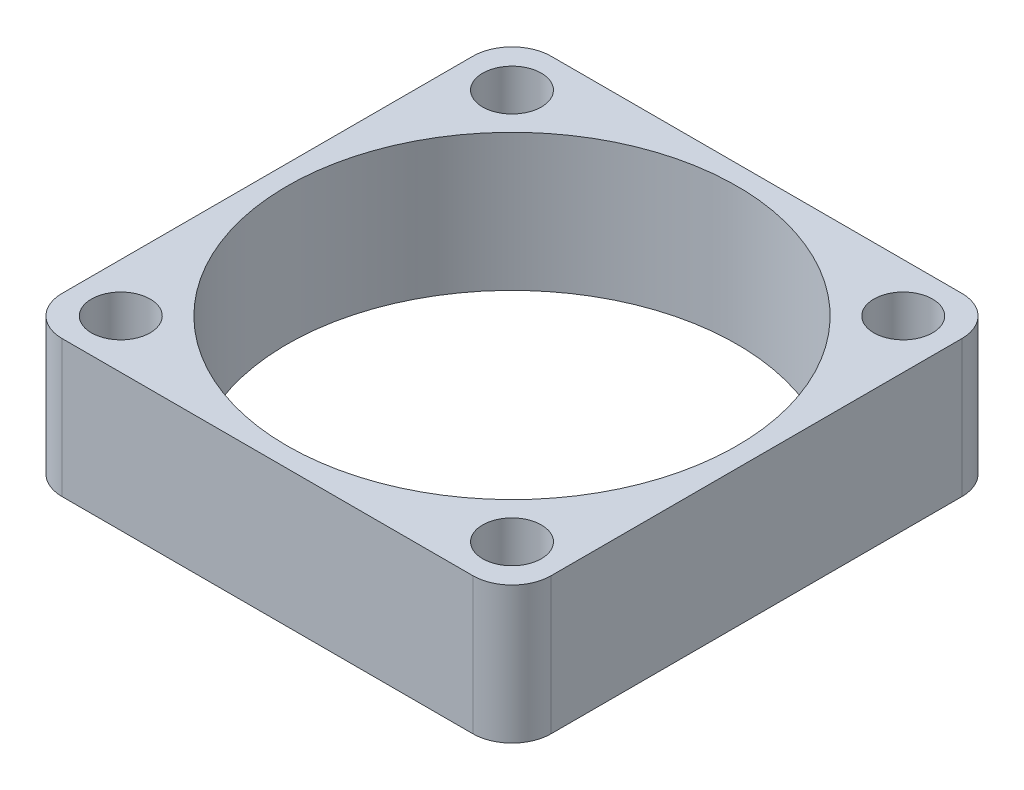
ISO-10303-21;
HEADER;
FILE_DESCRIPTION(('STEP AP214'),'2;1');
FILE_NAME('part.step','',(''),(''),'','','');
FILE_SCHEMA(('AUTOMOTIVE_DESIGN { 1 0 10303 214 1 1 1 1 }'));
ENDSEC;
DATA;
#1=APPLICATION_CONTEXT('core data for automotive mechanical design processes');
#2=APPLICATION_PROTOCOL_DEFINITION('international standard','automotive_design',2000,#1);
#3=PRODUCT_CONTEXT('',#1,'mechanical');
#4=PRODUCT('Part','Part','',(#3));
#5=PRODUCT_RELATED_PRODUCT_CATEGORY('part','',(#4));
#6=PRODUCT_DEFINITION_FORMATION('','',#4);
#7=PRODUCT_DEFINITION_CONTEXT('part definition',#1,'design');
#8=PRODUCT_DEFINITION('design','',#6,#7);
#9=PRODUCT_DEFINITION_SHAPE('','',#8);
#10=(LENGTH_UNIT() NAMED_UNIT(*) SI_UNIT(.MILLI.,.METRE.));
#11=(NAMED_UNIT(*) PLANE_ANGLE_UNIT() SI_UNIT($,.RADIAN.));
#12=(NAMED_UNIT(*) SI_UNIT($,.STERADIAN.) SOLID_ANGLE_UNIT());
#13=UNCERTAINTY_MEASURE_WITH_UNIT(LENGTH_MEASURE(1.E-05),#10,'distance_accuracy_value','');
#14=(GEOMETRIC_REPRESENTATION_CONTEXT(3) GLOBAL_UNCERTAINTY_ASSIGNED_CONTEXT((#13)) GLOBAL_UNIT_ASSIGNED_CONTEXT((#10,
#11,#12)) REPRESENTATION_CONTEXT('',''));
#15=CARTESIAN_POINT('',(0.,0.,0.));
#16=DIRECTION('',(0.,0.,1.));
#17=DIRECTION('',(1.,0.,0.));
#18=AXIS2_PLACEMENT_3D('',#15,#16,#17);
#19=CARTESIAN_POINT('',(0.,7.,0.));
#20=DIRECTION('',(0.,-1.,0.));
#21=DIRECTION('',(0.,0.,-1.));
#22=AXIS2_PLACEMENT_3D('',#19,#20,#21);
#23=PLANE('',#22);
#24=CARTESIAN_POINT('',(0.,7.,0.));
#25=DIRECTION('',(0.,1.,0.));
#26=DIRECTION('',(0.,0.,1.));
#27=AXIS2_PLACEMENT_3D('',#24,#25,#26);
#28=CIRCLE('',#27,11.5);
#29=CARTESIAN_POINT('',(0.,7.,11.5));
#30=VERTEX_POINT('',#29);
#31=EDGE_CURVE('E203',#30,#30,#28,.T.);
#32=ORIENTED_EDGE('',*,*,#31,.F.);
#33=EDGE_LOOP('',(#32));
#34=FACE_BOUND('',#33,.T.);
#35=DIRECTION('',(0.,0.,-1.));
#36=VECTOR('',#35,1.);
#37=CARTESIAN_POINT('',(12.5,7.,12.5));
#38=LINE('',#37,#36);
#39=CARTESIAN_POINT('',(12.5,7.,10.5));
#40=VERTEX_POINT('',#39);
#41=CARTESIAN_POINT('',(12.5,7.,-10.5));
#42=VERTEX_POINT('',#41);
#43=EDGE_CURVE('E139',#40,#42,#38,.T.);
#44=ORIENTED_EDGE('',*,*,#43,.T.);
#45=CARTESIAN_POINT('',(10.5,7.,-10.5));
#46=DIRECTION('',(0.,-1.,0.));
#47=DIRECTION('',(0.,0.,-1.));
#48=AXIS2_PLACEMENT_3D('',#45,#46,#47);
#49=CIRCLE('',#48,2.);
#50=CARTESIAN_POINT('',(10.5,7.,-12.5));
#51=VERTEX_POINT('',#50);
#52=EDGE_CURVE('E154',#42,#51,#49,.F.);
#53=ORIENTED_EDGE('',*,*,#52,.T.);
#54=DIRECTION('',(-1.,0.,0.));
#55=VECTOR('',#54,1.);
#56=CARTESIAN_POINT('',(-12.5,7.,-12.5));
#57=LINE('',#56,#55);
#58=CARTESIAN_POINT('',(-10.5,7.,-12.5));
#59=VERTEX_POINT('',#58);
#60=EDGE_CURVE('E121',#51,#59,#57,.T.);
#61=ORIENTED_EDGE('',*,*,#60,.T.);
#62=CARTESIAN_POINT('',(-10.5,7.,-10.5));
#63=DIRECTION('',(0.,-1.,0.));
#64=DIRECTION('',(0.,0.,-1.));
#65=AXIS2_PLACEMENT_3D('',#62,#63,#64);
#66=CIRCLE('',#65,2.);
#67=CARTESIAN_POINT('',(-12.5,7.,-10.5));
#68=VERTEX_POINT('',#67);
#69=EDGE_CURVE('E152',#59,#68,#66,.F.);
#70=ORIENTED_EDGE('',*,*,#69,.T.);
#71=DIRECTION('',(0.,0.,1.));
#72=VECTOR('',#71,1.);
#73=CARTESIAN_POINT('',(-12.5,7.,12.5));
#74=LINE('',#73,#72);
#75=CARTESIAN_POINT('',(-12.5,7.,10.5));
#76=VERTEX_POINT('',#75);
#77=EDGE_CURVE('E165',#68,#76,#74,.T.);
#78=ORIENTED_EDGE('',*,*,#77,.T.);
#79=CARTESIAN_POINT('',(-10.5,7.,10.5));
#80=DIRECTION('',(0.,-1.,0.));
#81=DIRECTION('',(0.,0.,-1.));
#82=AXIS2_PLACEMENT_3D('',#79,#80,#81);
#83=CIRCLE('',#82,2.);
#84=CARTESIAN_POINT('',(-10.5,7.,12.5));
#85=VERTEX_POINT('',#84);
#86=EDGE_CURVE('E56',#76,#85,#83,.F.);
#87=ORIENTED_EDGE('',*,*,#86,.T.);
#88=DIRECTION('',(1.,0.,0.));
#89=VECTOR('',#88,1.);
#90=CARTESIAN_POINT('',(-12.5,7.,12.5));
#91=LINE('',#90,#89);
#92=CARTESIAN_POINT('',(10.5,7.,12.5));
#93=VERTEX_POINT('',#92);
#94=EDGE_CURVE('E140',#85,#93,#91,.T.);
#95=ORIENTED_EDGE('',*,*,#94,.T.);
#96=CARTESIAN_POINT('',(10.5,7.,10.5));
#97=DIRECTION('',(0.,-1.,0.));
#98=DIRECTION('',(0.,0.,-1.));
#99=AXIS2_PLACEMENT_3D('',#96,#97,#98);
#100=CIRCLE('',#99,2.);
#101=EDGE_CURVE('E149',#93,#40,#100,.F.);
#102=ORIENTED_EDGE('',*,*,#101,.T.);
#103=EDGE_LOOP('',(#44,#53,#61,#70,#78,#87,#95,#102));
#104=FACE_BOUND('',#103,.T.);
#105=CARTESIAN_POINT('',(-10.,7.,10.));
#106=DIRECTION('',(0.,1.,0.));
#107=DIRECTION('',(0.,0.,1.));
#108=AXIS2_PLACEMENT_3D('',#105,#106,#107);
#109=CIRCLE('',#108,1.5);
#110=CARTESIAN_POINT('',(-10.,7.,11.5));
#111=VERTEX_POINT('',#110);
#112=EDGE_CURVE('E134',#111,#111,#109,.T.);
#113=ORIENTED_EDGE('',*,*,#112,.F.);
#114=EDGE_LOOP('',(#113));
#115=FACE_BOUND('',#114,.T.);
#116=CARTESIAN_POINT('',(10.,7.,10.));
#117=DIRECTION('',(0.,1.,0.));
#118=DIRECTION('',(0.,0.,1.));
#119=AXIS2_PLACEMENT_3D('',#116,#117,#118);
#120=CIRCLE('',#119,1.5);
#121=CARTESIAN_POINT('',(10.,7.,11.5));
#122=VERTEX_POINT('',#121);
#123=EDGE_CURVE('E182',#122,#122,#120,.T.);
#124=ORIENTED_EDGE('',*,*,#123,.F.);
#125=EDGE_LOOP('',(#124));
#126=FACE_BOUND('',#125,.T.);
#127=CARTESIAN_POINT('',(10.,7.,-10.));
#128=DIRECTION('',(0.,1.,0.));
#129=DIRECTION('',(0.,0.,1.));
#130=AXIS2_PLACEMENT_3D('',#127,#128,#129);
#131=CIRCLE('',#130,1.5);
#132=CARTESIAN_POINT('',(10.,7.,-8.5));
#133=VERTEX_POINT('',#132);
#134=EDGE_CURVE('E188',#133,#133,#131,.T.);
#135=ORIENTED_EDGE('',*,*,#134,.F.);
#136=EDGE_LOOP('',(#135));
#137=FACE_BOUND('',#136,.T.);
#138=CARTESIAN_POINT('',(-10.,7.,-10.));
#139=DIRECTION('',(0.,1.,0.));
#140=DIRECTION('',(0.,0.,1.));
#141=AXIS2_PLACEMENT_3D('',#138,#139,#140);
#142=CIRCLE('',#141,1.5);
#143=CARTESIAN_POINT('',(-10.,7.,-8.5));
#144=VERTEX_POINT('',#143);
#145=EDGE_CURVE('E194',#144,#144,#142,.T.);
#146=ORIENTED_EDGE('',*,*,#145,.F.);
#147=EDGE_LOOP('',(#146));
#148=FACE_BOUND('',#147,.T.);
#149=ADVANCED_FACE('F35',(#34,#104,#115,#126,#137,#148),#23,.F.);
#150=CARTESIAN_POINT('',(0.,0.,0.));
#151=DIRECTION('',(0.,-1.,0.));
#152=DIRECTION('',(0.,0.,-1.));
#153=AXIS2_PLACEMENT_3D('',#150,#151,#152);
#154=PLANE('',#153);
#155=CARTESIAN_POINT('',(0.,0.,0.));
#156=DIRECTION('',(0.,1.,0.));
#157=DIRECTION('',(0.,0.,1.));
#158=AXIS2_PLACEMENT_3D('',#155,#156,#157);
#159=CIRCLE('',#158,11.5);
#160=CARTESIAN_POINT('',(0.,0.,11.5));
#161=VERTEX_POINT('',#160);
#162=EDGE_CURVE('E200',#161,#161,#159,.T.);
#163=ORIENTED_EDGE('',*,*,#162,.T.);
#164=EDGE_LOOP('',(#163));
#165=FACE_BOUND('',#164,.T.);
#166=CARTESIAN_POINT('',(10.,0.,-10.));
#167=DIRECTION('',(0.,1.,0.));
#168=DIRECTION('',(0.,0.,1.));
#169=AXIS2_PLACEMENT_3D('',#166,#167,#168);
#170=CIRCLE('',#169,1.5);
#171=CARTESIAN_POINT('',(10.,0.,-8.5));
#172=VERTEX_POINT('',#171);
#173=EDGE_CURVE('E191',#172,#172,#170,.T.);
#174=ORIENTED_EDGE('',*,*,#173,.T.);
#175=EDGE_LOOP('',(#174));
#176=FACE_BOUND('',#175,.T.);
#177=CARTESIAN_POINT('',(-10.,0.,10.));
#178=DIRECTION('',(0.,1.,0.));
#179=DIRECTION('',(0.,0.,1.));
#180=AXIS2_PLACEMENT_3D('',#177,#178,#179);
#181=CIRCLE('',#180,1.5);
#182=CARTESIAN_POINT('',(-10.,0.,11.5));
#183=VERTEX_POINT('',#182);
#184=EDGE_CURVE('E179',#183,#183,#181,.T.);
#185=ORIENTED_EDGE('',*,*,#184,.T.);
#186=EDGE_LOOP('',(#185));
#187=FACE_BOUND('',#186,.T.);
#188=DIRECTION('',(-1.,0.,0.));
#189=VECTOR('',#188,1.);
#190=CARTESIAN_POINT('',(-12.5,0.,-12.5));
#191=LINE('',#190,#189);
#192=CARTESIAN_POINT('',(10.5,0.,-12.5));
#193=VERTEX_POINT('',#192);
#194=CARTESIAN_POINT('',(-10.5,0.,-12.5));
#195=VERTEX_POINT('',#194);
#196=EDGE_CURVE('E118',#193,#195,#191,.T.);
#197=ORIENTED_EDGE('',*,*,#196,.F.);
#198=CARTESIAN_POINT('',(10.5,0.,-10.5));
#199=DIRECTION('',(0.,-1.,0.));
#200=DIRECTION('',(0.,0.,-1.));
#201=AXIS2_PLACEMENT_3D('',#198,#199,#200);
#202=CIRCLE('',#201,2.);
#203=CARTESIAN_POINT('',(12.5,0.,-10.5));
#204=VERTEX_POINT('',#203);
#205=EDGE_CURVE('E101',#193,#204,#202,.T.);
#206=ORIENTED_EDGE('',*,*,#205,.T.);
#207=DIRECTION('',(0.,0.,-1.));
#208=VECTOR('',#207,1.);
#209=CARTESIAN_POINT('',(12.5,0.,12.5));
#210=LINE('',#209,#208);
#211=CARTESIAN_POINT('',(12.5,0.,10.5));
#212=VERTEX_POINT('',#211);
#213=EDGE_CURVE('E129',#212,#204,#210,.T.);
#214=ORIENTED_EDGE('',*,*,#213,.F.);
#215=CARTESIAN_POINT('',(10.5,0.,10.5));
#216=DIRECTION('',(0.,-1.,0.));
#217=DIRECTION('',(0.,0.,-1.));
#218=AXIS2_PLACEMENT_3D('',#215,#216,#217);
#219=CIRCLE('',#218,2.);
#220=CARTESIAN_POINT('',(10.5,0.,12.5));
#221=VERTEX_POINT('',#220);
#222=EDGE_CURVE('E122',#212,#221,#219,.T.);
#223=ORIENTED_EDGE('',*,*,#222,.T.);
#224=DIRECTION('',(1.,0.,0.));
#225=VECTOR('',#224,1.);
#226=CARTESIAN_POINT('',(-12.5,0.,12.5));
#227=LINE('',#226,#225);
#228=CARTESIAN_POINT('',(-10.5,0.,12.5));
#229=VERTEX_POINT('',#228);
#230=EDGE_CURVE('E132',#229,#221,#227,.T.);
#231=ORIENTED_EDGE('',*,*,#230,.F.);
#232=CARTESIAN_POINT('',(-10.5,0.,10.5));
#233=DIRECTION('',(0.,-1.,0.));
#234=DIRECTION('',(0.,0.,-1.));
#235=AXIS2_PLACEMENT_3D('',#232,#233,#234);
#236=CIRCLE('',#235,2.);
#237=CARTESIAN_POINT('',(-12.5,0.,10.5));
#238=VERTEX_POINT('',#237);
#239=EDGE_CURVE('E143',#229,#238,#236,.T.);
#240=ORIENTED_EDGE('',*,*,#239,.T.);
#241=DIRECTION('',(0.,0.,1.));
#242=VECTOR('',#241,1.);
#243=CARTESIAN_POINT('',(-12.5,0.,12.5));
#244=LINE('',#243,#242);
#245=CARTESIAN_POINT('',(-12.5,0.,-10.5));
#246=VERTEX_POINT('',#245);
#247=EDGE_CURVE('E128',#246,#238,#244,.T.);
#248=ORIENTED_EDGE('',*,*,#247,.F.);
#249=CARTESIAN_POINT('',(-10.5,0.,-10.5));
#250=DIRECTION('',(0.,-1.,0.));
#251=DIRECTION('',(0.,0.,-1.));
#252=AXIS2_PLACEMENT_3D('',#249,#250,#251);
#253=CIRCLE('',#252,2.);
#254=EDGE_CURVE('E112',#246,#195,#253,.T.);
#255=ORIENTED_EDGE('',*,*,#254,.T.);
#256=EDGE_LOOP('',(#197,#206,#214,#223,#231,#240,#248,#255));
#257=FACE_BOUND('',#256,.T.);
#258=CARTESIAN_POINT('',(10.,0.,10.));
#259=DIRECTION('',(0.,1.,0.));
#260=DIRECTION('',(0.,0.,1.));
#261=AXIS2_PLACEMENT_3D('',#258,#259,#260);
#262=CIRCLE('',#261,1.5);
#263=CARTESIAN_POINT('',(10.,0.,11.5));
#264=VERTEX_POINT('',#263);
#265=EDGE_CURVE('E185',#264,#264,#262,.T.);
#266=ORIENTED_EDGE('',*,*,#265,.T.);
#267=EDGE_LOOP('',(#266));
#268=FACE_BOUND('',#267,.T.);
#269=CARTESIAN_POINT('',(-10.,0.,-10.));
#270=DIRECTION('',(0.,1.,0.));
#271=DIRECTION('',(0.,0.,1.));
#272=AXIS2_PLACEMENT_3D('',#269,#270,#271);
#273=CIRCLE('',#272,1.5);
#274=CARTESIAN_POINT('',(-10.,0.,-8.5));
#275=VERTEX_POINT('',#274);
#276=EDGE_CURVE('E197',#275,#275,#273,.T.);
#277=ORIENTED_EDGE('',*,*,#276,.T.);
#278=EDGE_LOOP('',(#277));
#279=FACE_BOUND('',#278,.T.);
#280=ADVANCED_FACE('F125',(#165,#176,#187,#257,#268,#279),#154,.T.);
#281=CARTESIAN_POINT('',(12.5,7.,12.5));
#282=DIRECTION('',(-1.,0.,0.));
#283=DIRECTION('',(0.,0.,1.));
#284=AXIS2_PLACEMENT_3D('',#281,#282,#283);
#285=PLANE('',#284);
#286=ORIENTED_EDGE('',*,*,#213,.T.);
#287=DIRECTION('',(0.,-1.,0.));
#288=VECTOR('',#287,1.);
#289=CARTESIAN_POINT('',(12.5,7.,-10.5));
#290=LINE('',#289,#288);
#291=EDGE_CURVE('E106',#204,#42,#290,.F.);
#292=ORIENTED_EDGE('',*,*,#291,.T.);
#293=ORIENTED_EDGE('',*,*,#43,.F.);
#294=DIRECTION('',(0.,-1.,0.));
#295=VECTOR('',#294,1.);
#296=CARTESIAN_POINT('',(12.5,7.,10.5));
#297=LINE('',#296,#295);
#298=EDGE_CURVE('E111',#40,#212,#297,.T.);
#299=ORIENTED_EDGE('',*,*,#298,.T.);
#300=EDGE_LOOP('',(#286,#292,#293,#299));
#301=FACE_BOUND('',#300,.T.);
#302=ADVANCED_FACE('F237',(#301),#285,.F.);
#303=CARTESIAN_POINT('',(-12.5,7.,-12.5));
#304=DIRECTION('',(0.,0.,1.));
#305=DIRECTION('',(1.,0.,0.));
#306=AXIS2_PLACEMENT_3D('',#303,#304,#305);
#307=PLANE('',#306);
#308=ORIENTED_EDGE('',*,*,#60,.F.);
#309=DIRECTION('',(0.,-1.,0.));
#310=VECTOR('',#309,1.);
#311=CARTESIAN_POINT('',(10.5,7.,-12.5));
#312=LINE('',#311,#310);
#313=EDGE_CURVE('E105',#51,#193,#312,.T.);
#314=ORIENTED_EDGE('',*,*,#313,.T.);
#315=ORIENTED_EDGE('',*,*,#196,.T.);
#316=DIRECTION('',(0.,-1.,0.));
#317=VECTOR('',#316,1.);
#318=CARTESIAN_POINT('',(-10.5,7.,-12.5));
#319=LINE('',#318,#317);
#320=EDGE_CURVE('E123',#195,#59,#319,.F.);
#321=ORIENTED_EDGE('',*,*,#320,.T.);
#322=EDGE_LOOP('',(#308,#314,#315,#321));
#323=FACE_BOUND('',#322,.T.);
#324=ADVANCED_FACE('F117',(#323),#307,.F.);
#325=CARTESIAN_POINT('',(-12.5,7.,12.5));
#326=DIRECTION('',(1.,0.,0.));
#327=DIRECTION('',(0.,0.,-1.));
#328=AXIS2_PLACEMENT_3D('',#325,#326,#327);
#329=PLANE('',#328);
#330=ORIENTED_EDGE('',*,*,#77,.F.);
#331=DIRECTION('',(0.,-1.,0.));
#332=VECTOR('',#331,1.);
#333=CARTESIAN_POINT('',(-12.5,7.,-10.5));
#334=LINE('',#333,#332);
#335=EDGE_CURVE('E158',#68,#246,#334,.T.);
#336=ORIENTED_EDGE('',*,*,#335,.T.);
#337=ORIENTED_EDGE('',*,*,#247,.T.);
#338=DIRECTION('',(0.,-1.,0.));
#339=VECTOR('',#338,1.);
#340=CARTESIAN_POINT('',(-12.5,7.,10.5));
#341=LINE('',#340,#339);
#342=EDGE_CURVE('E156',#238,#76,#341,.F.);
#343=ORIENTED_EDGE('',*,*,#342,.T.);
#344=EDGE_LOOP('',(#330,#336,#337,#343));
#345=FACE_BOUND('',#344,.T.);
#346=ADVANCED_FACE('F163',(#345),#329,.F.);
#347=CARTESIAN_POINT('',(-12.5,7.,12.5));
#348=DIRECTION('',(0.,0.,-1.));
#349=DIRECTION('',(-1.,0.,0.));
#350=AXIS2_PLACEMENT_3D('',#347,#348,#349);
#351=PLANE('',#350);
#352=ORIENTED_EDGE('',*,*,#94,.F.);
#353=DIRECTION('',(0.,-1.,0.));
#354=VECTOR('',#353,1.);
#355=CARTESIAN_POINT('',(-10.5,7.,12.5));
#356=LINE('',#355,#354);
#357=EDGE_CURVE('E11',#85,#229,#356,.T.);
#358=ORIENTED_EDGE('',*,*,#357,.T.);
#359=ORIENTED_EDGE('',*,*,#230,.T.);
#360=DIRECTION('',(0.,-1.,0.));
#361=VECTOR('',#360,1.);
#362=CARTESIAN_POINT('',(10.5,7.,12.5));
#363=LINE('',#362,#361);
#364=EDGE_CURVE('E43',#221,#93,#363,.F.);
#365=ORIENTED_EDGE('',*,*,#364,.T.);
#366=EDGE_LOOP('',(#352,#358,#359,#365));
#367=FACE_BOUND('',#366,.T.);
#368=ADVANCED_FACE('F172',(#367),#351,.F.);
#369=CARTESIAN_POINT('',(-10.,7.,10.));
#370=DIRECTION('',(0.,-1.,0.));
#371=DIRECTION('',(0.,0.,-1.));
#372=AXIS2_PLACEMENT_3D('',#369,#370,#371);
#373=CYLINDRICAL_SURFACE('',#372,1.5);
#374=ORIENTED_EDGE('',*,*,#112,.T.);
#375=EDGE_LOOP('',(#374));
#376=FACE_BOUND('',#375,.T.);
#377=ORIENTED_EDGE('',*,*,#184,.F.);
#378=EDGE_LOOP('',(#377));
#379=FACE_BOUND('',#378,.T.);
#380=ADVANCED_FACE('F248',(#376,#379),#373,.F.);
#381=CARTESIAN_POINT('',(10.,7.,10.));
#382=DIRECTION('',(0.,-1.,0.));
#383=DIRECTION('',(0.,0.,-1.));
#384=AXIS2_PLACEMENT_3D('',#381,#382,#383);
#385=CYLINDRICAL_SURFACE('',#384,1.5);
#386=ORIENTED_EDGE('',*,*,#123,.T.);
#387=EDGE_LOOP('',(#386));
#388=FACE_BOUND('',#387,.T.);
#389=ORIENTED_EDGE('',*,*,#265,.F.);
#390=EDGE_LOOP('',(#389));
#391=FACE_BOUND('',#390,.T.);
#392=ADVANCED_FACE('F311',(#388,#391),#385,.F.);
#393=CARTESIAN_POINT('',(10.,7.,-10.));
#394=DIRECTION('',(0.,-1.,0.));
#395=DIRECTION('',(0.,0.,-1.));
#396=AXIS2_PLACEMENT_3D('',#393,#394,#395);
#397=CYLINDRICAL_SURFACE('',#396,1.5);
#398=ORIENTED_EDGE('',*,*,#134,.T.);
#399=EDGE_LOOP('',(#398));
#400=FACE_BOUND('',#399,.T.);
#401=ORIENTED_EDGE('',*,*,#173,.F.);
#402=EDGE_LOOP('',(#401));
#403=FACE_BOUND('',#402,.T.);
#404=ADVANCED_FACE('F232',(#400,#403),#397,.F.);
#405=CARTESIAN_POINT('',(-10.,7.,-10.));
#406=DIRECTION('',(0.,-1.,0.));
#407=DIRECTION('',(0.,0.,-1.));
#408=AXIS2_PLACEMENT_3D('',#405,#406,#407);
#409=CYLINDRICAL_SURFACE('',#408,1.5);
#410=ORIENTED_EDGE('',*,*,#145,.T.);
#411=EDGE_LOOP('',(#410));
#412=FACE_BOUND('',#411,.T.);
#413=ORIENTED_EDGE('',*,*,#276,.F.);
#414=EDGE_LOOP('',(#413));
#415=FACE_BOUND('',#414,.T.);
#416=ADVANCED_FACE('F229',(#412,#415),#409,.F.);
#417=CARTESIAN_POINT('',(10.5,7.,-10.5));
#418=DIRECTION('',(0.,-1.,0.));
#419=DIRECTION('',(0.,0.,-1.));
#420=AXIS2_PLACEMENT_3D('',#417,#418,#419);
#421=CYLINDRICAL_SURFACE('',#420,2.);
#422=ORIENTED_EDGE('',*,*,#52,.F.);
#423=ORIENTED_EDGE('',*,*,#291,.F.);
#424=ORIENTED_EDGE('',*,*,#205,.F.);
#425=ORIENTED_EDGE('',*,*,#313,.F.);
#426=EDGE_LOOP('',(#422,#423,#424,#425));
#427=FACE_BOUND('',#426,.T.);
#428=ADVANCED_FACE('F104',(#427),#421,.T.);
#429=CARTESIAN_POINT('',(-10.5,7.,-10.5));
#430=DIRECTION('',(0.,-1.,0.));
#431=DIRECTION('',(0.,0.,-1.));
#432=AXIS2_PLACEMENT_3D('',#429,#430,#431);
#433=CYLINDRICAL_SURFACE('',#432,2.);
#434=ORIENTED_EDGE('',*,*,#69,.F.);
#435=ORIENTED_EDGE('',*,*,#320,.F.);
#436=ORIENTED_EDGE('',*,*,#254,.F.);
#437=ORIENTED_EDGE('',*,*,#335,.F.);
#438=EDGE_LOOP('',(#434,#435,#436,#437));
#439=FACE_BOUND('',#438,.T.);
#440=ADVANCED_FACE('F255',(#439),#433,.T.);
#441=CARTESIAN_POINT('',(-10.5,7.,10.5));
#442=DIRECTION('',(0.,-1.,0.));
#443=DIRECTION('',(0.,0.,-1.));
#444=AXIS2_PLACEMENT_3D('',#441,#442,#443);
#445=CYLINDRICAL_SURFACE('',#444,2.);
#446=ORIENTED_EDGE('',*,*,#86,.F.);
#447=ORIENTED_EDGE('',*,*,#342,.F.);
#448=ORIENTED_EDGE('',*,*,#239,.F.);
#449=ORIENTED_EDGE('',*,*,#357,.F.);
#450=EDGE_LOOP('',(#446,#447,#448,#449));
#451=FACE_BOUND('',#450,.T.);
#452=ADVANCED_FACE('F171',(#451),#445,.T.);
#453=CARTESIAN_POINT('',(10.5,7.,10.5));
#454=DIRECTION('',(0.,-1.,0.));
#455=DIRECTION('',(0.,0.,-1.));
#456=AXIS2_PLACEMENT_3D('',#453,#454,#455);
#457=CYLINDRICAL_SURFACE('',#456,2.);
#458=ORIENTED_EDGE('',*,*,#101,.F.);
#459=ORIENTED_EDGE('',*,*,#364,.F.);
#460=ORIENTED_EDGE('',*,*,#222,.F.);
#461=ORIENTED_EDGE('',*,*,#298,.F.);
#462=EDGE_LOOP('',(#458,#459,#460,#461));
#463=FACE_BOUND('',#462,.T.);
#464=ADVANCED_FACE('F37',(#463),#457,.T.);
#465=CARTESIAN_POINT('',(0.,0.,0.));
#466=DIRECTION('',(0.,1.,0.));
#467=DIRECTION('',(0.,0.,1.));
#468=AXIS2_PLACEMENT_3D('',#465,#466,#467);
#469=CYLINDRICAL_SURFACE('',#468,11.5);
#470=ORIENTED_EDGE('',*,*,#162,.F.);
#471=EDGE_LOOP('',(#470));
#472=FACE_BOUND('',#471,.T.);
#473=ORIENTED_EDGE('',*,*,#31,.T.);
#474=EDGE_LOOP('',(#473));
#475=FACE_BOUND('',#474,.T.);
#476=ADVANCED_FACE('F211',(#472,#475),#469,.F.);
#477=CLOSED_SHELL('',(#149,#280,#302,#324,#346,#368,#380,#392,#404,#416,#428,#440,#452,#464,#476));
#478=MANIFOLD_SOLID_BREP('B2',#477);
#479=ADVANCED_BREP_SHAPE_REPRESENTATION('',(#18,#478),#14);
#480=SHAPE_DEFINITION_REPRESENTATION(#9,#479);
ENDSEC;
END-ISO-10303-21;
